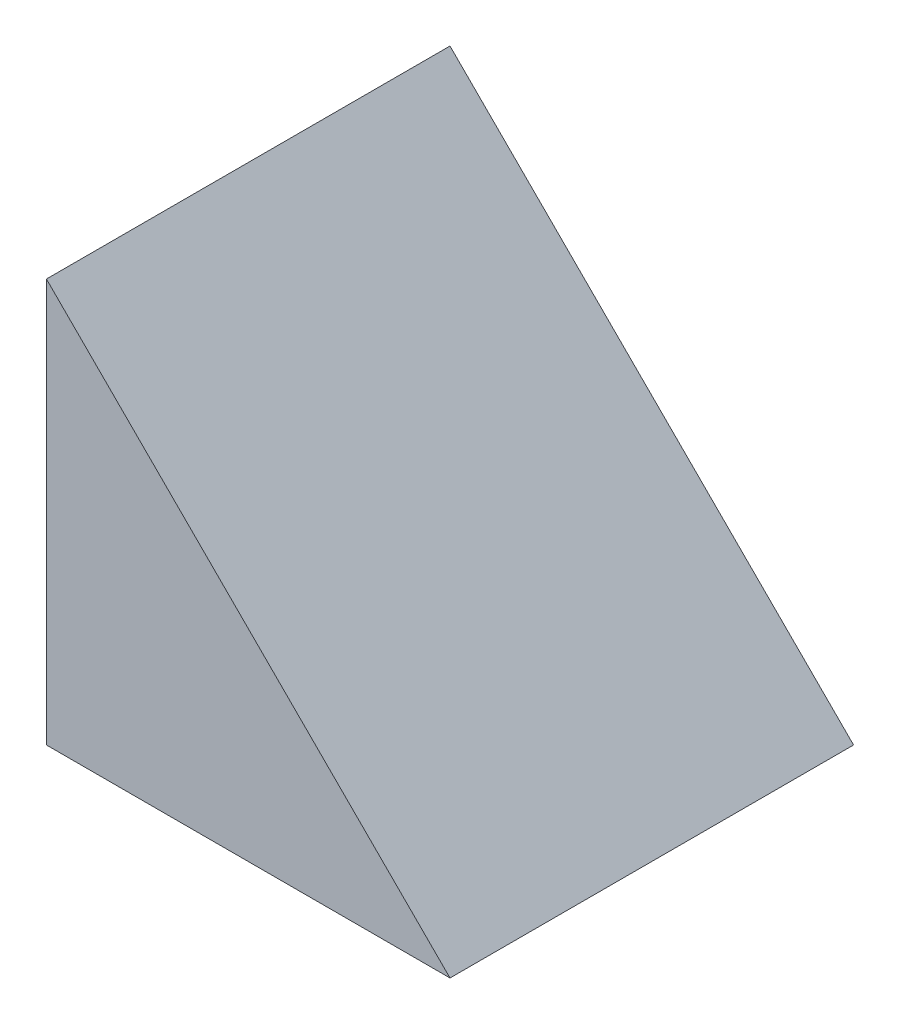
ISO-10303-21;
HEADER;
FILE_DESCRIPTION(('STEP AP214'),'2;1');
FILE_NAME('part.step','',(''),(''),'','','');
FILE_SCHEMA(('AUTOMOTIVE_DESIGN { 1 0 10303 214 1 1 1 1 }'));
ENDSEC;
DATA;
#1=APPLICATION_CONTEXT('core data for automotive mechanical design processes');
#2=APPLICATION_PROTOCOL_DEFINITION('international standard','automotive_design',2000,#1);
#3=PRODUCT_CONTEXT('',#1,'mechanical');
#4=PRODUCT('Part','Part','',(#3));
#5=PRODUCT_RELATED_PRODUCT_CATEGORY('part','',(#4));
#6=PRODUCT_DEFINITION_FORMATION('','',#4);
#7=PRODUCT_DEFINITION_CONTEXT('part definition',#1,'design');
#8=PRODUCT_DEFINITION('design','',#6,#7);
#9=PRODUCT_DEFINITION_SHAPE('','',#8);
#10=(LENGTH_UNIT() NAMED_UNIT(*) SI_UNIT(.MILLI.,.METRE.));
#11=(NAMED_UNIT(*) PLANE_ANGLE_UNIT() SI_UNIT($,.RADIAN.));
#12=(NAMED_UNIT(*) SI_UNIT($,.STERADIAN.) SOLID_ANGLE_UNIT());
#13=UNCERTAINTY_MEASURE_WITH_UNIT(LENGTH_MEASURE(1.E-05),#10,'distance_accuracy_value','');
#14=(GEOMETRIC_REPRESENTATION_CONTEXT(3) GLOBAL_UNCERTAINTY_ASSIGNED_CONTEXT((#13)) GLOBAL_UNIT_ASSIGNED_CONTEXT((#10,
#11,#12)) REPRESENTATION_CONTEXT('',''));
#15=CARTESIAN_POINT('',(0.,0.,0.));
#16=DIRECTION('',(0.,0.,1.));
#17=DIRECTION('',(1.,0.,0.));
#18=AXIS2_PLACEMENT_3D('',#15,#16,#17);
#19=CARTESIAN_POINT('',(-429.913122260929,4401.62342678953,5000.));
#20=DIRECTION('',(1.,0.,0.));
#21=DIRECTION('',(0.,1.,0.));
#22=AXIS2_PLACEMENT_3D('',#19,#20,#21);
#23=PLANE('',#22);
#24=DIRECTION('',(0.,-1.,0.));
#25=VECTOR('',#24,1.);
#26=CARTESIAN_POINT('',(-429.913122260929,4401.62342678953,0.));
#27=LINE('',#26,#25);
#28=CARTESIAN_POINT('',(-429.913122260929,4401.62342678953,0.));
#29=VERTEX_POINT('',#28);
#30=CARTESIAN_POINT('',(-429.913122260928,-598.376573210473,0.));
#31=VERTEX_POINT('',#30);
#32=EDGE_CURVE('E80',#29,#31,#27,.T.);
#33=ORIENTED_EDGE('',*,*,#32,.T.);
#34=DIRECTION('',(0.,0.,-1.));
#35=VECTOR('',#34,1.);
#36=CARTESIAN_POINT('',(-429.913122260928,-598.376573210473,5000.));
#37=LINE('',#36,#35);
#38=CARTESIAN_POINT('',(-429.913122260928,-598.376573210473,5000.));
#39=VERTEX_POINT('',#38);
#40=EDGE_CURVE('E11',#39,#31,#37,.T.);
#41=ORIENTED_EDGE('',*,*,#40,.F.);
#42=DIRECTION('',(0.,-1.,0.));
#43=VECTOR('',#42,1.);
#44=CARTESIAN_POINT('',(-429.913122260929,4401.62342678953,5000.));
#45=LINE('',#44,#43);
#46=CARTESIAN_POINT('',(-429.913122260929,4401.62342678953,5000.));
#47=VERTEX_POINT('',#46);
#48=EDGE_CURVE('E73',#47,#39,#45,.T.);
#49=ORIENTED_EDGE('',*,*,#48,.F.);
#50=DIRECTION('',(0.,0.,-1.));
#51=VECTOR('',#50,1.);
#52=CARTESIAN_POINT('',(-429.913122260929,4401.62342678953,5000.));
#53=LINE('',#52,#51);
#54=EDGE_CURVE('E81',#47,#29,#53,.T.);
#55=ORIENTED_EDGE('',*,*,#54,.T.);
#56=EDGE_LOOP('',(#33,#41,#49,#55));
#57=FACE_BOUND('',#56,.T.);
#58=ADVANCED_FACE('F33',(#57),#23,.F.);
#59=CARTESIAN_POINT('',(-429.913122260928,-598.376573210473,5000.));
#60=DIRECTION('',(0.,1.,0.));
#61=DIRECTION('',(0.,0.,1.));
#62=AXIS2_PLACEMENT_3D('',#59,#60,#61);
#63=PLANE('',#62);
#64=DIRECTION('',(1.,0.,0.));
#65=VECTOR('',#64,1.);
#66=CARTESIAN_POINT('',(-429.913122260928,-598.376573210473,0.));
#67=LINE('',#66,#65);
#68=CARTESIAN_POINT('',(4570.08687773907,-598.376573210473,0.));
#69=VERTEX_POINT('',#68);
#70=EDGE_CURVE('E61',#31,#69,#67,.T.);
#71=ORIENTED_EDGE('',*,*,#70,.T.);
#72=DIRECTION('',(0.,0.,-1.));
#73=VECTOR('',#72,1.);
#74=CARTESIAN_POINT('',(4570.08687773907,-598.376573210473,5000.));
#75=LINE('',#74,#73);
#76=CARTESIAN_POINT('',(4570.08687773907,-598.376573210473,5000.));
#77=VERTEX_POINT('',#76);
#78=EDGE_CURVE('E41',#77,#69,#75,.T.);
#79=ORIENTED_EDGE('',*,*,#78,.F.);
#80=DIRECTION('',(1.,0.,0.));
#81=VECTOR('',#80,1.);
#82=CARTESIAN_POINT('',(-429.913122260928,-598.376573210473,5000.));
#83=LINE('',#82,#81);
#84=EDGE_CURVE('E69',#39,#77,#83,.T.);
#85=ORIENTED_EDGE('',*,*,#84,.F.);
#86=ORIENTED_EDGE('',*,*,#40,.T.);
#87=EDGE_LOOP('',(#71,#79,#85,#86));
#88=FACE_BOUND('',#87,.T.);
#89=ADVANCED_FACE('F70',(#88),#63,.F.);
#90=CARTESIAN_POINT('',(-429.913122260929,4401.62342678953,5000.));
#91=DIRECTION('',(-0.707106781186547,-0.707106781186547,0.));
#92=DIRECTION('',(0.707106781186548,-0.707106781186548,0.));
#93=AXIS2_PLACEMENT_3D('',#90,#91,#92);
#94=PLANE('',#93);
#95=DIRECTION('',(-0.707106781186547,0.707106781186547,0.));
#96=VECTOR('',#95,1.);
#97=CARTESIAN_POINT('',(-429.913122260929,4401.62342678953,0.));
#98=LINE('',#97,#96);
#99=EDGE_CURVE('E66',#69,#29,#98,.T.);
#100=ORIENTED_EDGE('',*,*,#99,.T.);
#101=ORIENTED_EDGE('',*,*,#54,.F.);
#102=DIRECTION('',(-0.707106781186547,0.707106781186547,0.));
#103=VECTOR('',#102,1.);
#104=CARTESIAN_POINT('',(-429.913122260929,4401.62342678953,5000.));
#105=LINE('',#104,#103);
#106=EDGE_CURVE('E49',#77,#47,#105,.T.);
#107=ORIENTED_EDGE('',*,*,#106,.F.);
#108=ORIENTED_EDGE('',*,*,#78,.T.);
#109=EDGE_LOOP('',(#100,#101,#107,#108));
#110=FACE_BOUND('',#109,.T.);
#111=ADVANCED_FACE('F88',(#110),#94,.F.);
#112=CARTESIAN_POINT('',(0.,0.,5000.));
#113=DIRECTION('',(0.,0.,1.));
#114=DIRECTION('',(1.,0.,0.));
#115=AXIS2_PLACEMENT_3D('',#112,#113,#114);
#116=PLANE('',#115);
#117=ORIENTED_EDGE('',*,*,#48,.T.);
#118=ORIENTED_EDGE('',*,*,#84,.T.);
#119=ORIENTED_EDGE('',*,*,#106,.T.);
#120=EDGE_LOOP('',(#117,#118,#119));
#121=FACE_BOUND('',#120,.T.);
#122=ADVANCED_FACE('F76',(#121),#116,.T.);
#123=CARTESIAN_POINT('',(0.,0.,0.));
#124=DIRECTION('',(0.,0.,1.));
#125=DIRECTION('',(1.,0.,0.));
#126=AXIS2_PLACEMENT_3D('',#123,#124,#125);
#127=PLANE('',#126);
#128=ORIENTED_EDGE('',*,*,#32,.F.);
#129=ORIENTED_EDGE('',*,*,#99,.F.);
#130=ORIENTED_EDGE('',*,*,#70,.F.);
#131=EDGE_LOOP('',(#128,#129,#130));
#132=FACE_BOUND('',#131,.T.);
#133=ADVANCED_FACE('F89',(#132),#127,.F.);
#134=CLOSED_SHELL('',(#58,#89,#111,#122,#133));
#135=MANIFOLD_SOLID_BREP('B2',#134);
#136=ADVANCED_BREP_SHAPE_REPRESENTATION('',(#18,#135),#14);
#137=SHAPE_DEFINITION_REPRESENTATION(#9,#136);
ENDSEC;
END-ISO-10303-21;
